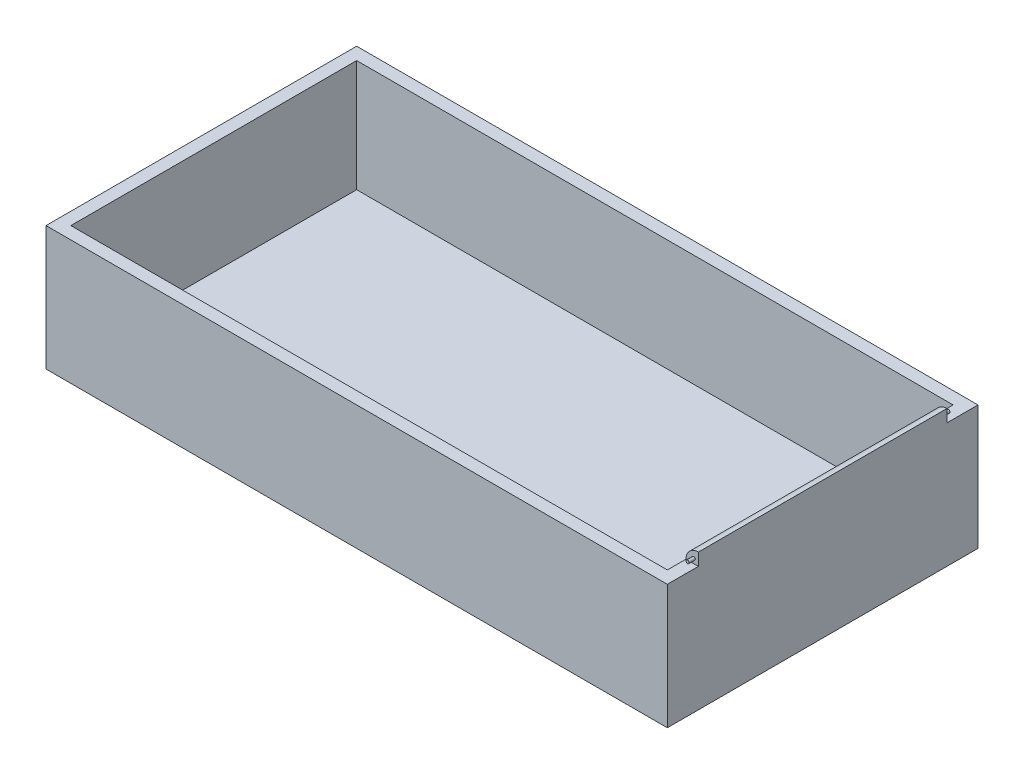
ISO-10303-21;
HEADER;
FILE_DESCRIPTION(('STEP AP214'),'2;1');
FILE_NAME('part.step','',(''),(''),'','','');
FILE_SCHEMA(('AUTOMOTIVE_DESIGN { 1 0 10303 214 1 1 1 1 }'));
ENDSEC;
DATA;
#1=APPLICATION_CONTEXT('core data for automotive mechanical design processes');
#2=APPLICATION_PROTOCOL_DEFINITION('international standard','automotive_design',2000,#1);
#3=PRODUCT_CONTEXT('',#1,'mechanical');
#4=PRODUCT('Part','Part','',(#3));
#5=PRODUCT_RELATED_PRODUCT_CATEGORY('part','',(#4));
#6=PRODUCT_DEFINITION_FORMATION('','',#4);
#7=PRODUCT_DEFINITION_CONTEXT('part definition',#1,'design');
#8=PRODUCT_DEFINITION('design','',#6,#7);
#9=PRODUCT_DEFINITION_SHAPE('','',#8);
#10=(LENGTH_UNIT() NAMED_UNIT(*) SI_UNIT(.MILLI.,.METRE.));
#11=(NAMED_UNIT(*) PLANE_ANGLE_UNIT() SI_UNIT($,.RADIAN.));
#12=(NAMED_UNIT(*) SI_UNIT($,.STERADIAN.) SOLID_ANGLE_UNIT());
#13=UNCERTAINTY_MEASURE_WITH_UNIT(LENGTH_MEASURE(1.E-05),#10,'distance_accuracy_value','');
#14=(GEOMETRIC_REPRESENTATION_CONTEXT(3) GLOBAL_UNCERTAINTY_ASSIGNED_CONTEXT((#13)) GLOBAL_UNIT_ASSIGNED_CONTEXT((#10,
#11,#12)) REPRESENTATION_CONTEXT('',''));
#15=CARTESIAN_POINT('',(0.,0.,0.));
#16=DIRECTION('',(0.,0.,1.));
#17=DIRECTION('',(1.,0.,0.));
#18=AXIS2_PLACEMENT_3D('',#15,#16,#17);
#19=CARTESIAN_POINT('',(0.,25.4,0.));
#20=DIRECTION('',(0.,-1.,0.));
#21=DIRECTION('',(0.,0.,-1.));
#22=AXIS2_PLACEMENT_3D('',#19,#20,#21);
#23=PLANE('',#22);
#24=DIRECTION('',(1.,0.,0.));
#25=VECTOR('',#24,1.);
#26=CARTESIAN_POINT('',(124.46,25.4,-6.35));
#27=LINE('',#26,#25);
#28=CARTESIAN_POINT('',(124.46,25.4,-6.35));
#29=VERTEX_POINT('',#28);
#30=CARTESIAN_POINT('',(127.,25.4,-6.35));
#31=VERTEX_POINT('',#30);
#32=EDGE_CURVE('E142',#29,#31,#27,.T.);
#33=ORIENTED_EDGE('',*,*,#32,.F.);
#34=DIRECTION('',(0.,0.,-1.));
#35=VECTOR('',#34,1.);
#36=CARTESIAN_POINT('',(124.46,25.4,0.));
#37=LINE('',#36,#35);
#38=CARTESIAN_POINT('',(124.46,25.4,-2.54));
#39=VERTEX_POINT('',#38);
#40=EDGE_CURVE('E184',#39,#29,#37,.T.);
#41=ORIENTED_EDGE('',*,*,#40,.F.);
#42=DIRECTION('',(1.,0.,0.));
#43=VECTOR('',#42,1.);
#44=CARTESIAN_POINT('',(0.,25.4,-2.54));
#45=LINE('',#44,#43);
#46=CARTESIAN_POINT('',(2.54,25.4,-2.54));
#47=VERTEX_POINT('',#46);
#48=EDGE_CURVE('E182',#47,#39,#45,.T.);
#49=ORIENTED_EDGE('',*,*,#48,.F.);
#50=DIRECTION('',(0.,0.,1.));
#51=VECTOR('',#50,1.);
#52=CARTESIAN_POINT('',(2.54,25.4,0.));
#53=LINE('',#52,#51);
#54=CARTESIAN_POINT('',(2.53999999999997,25.4,-60.96));
#55=VERTEX_POINT('',#54);
#56=EDGE_CURVE('E180',#55,#47,#53,.T.);
#57=ORIENTED_EDGE('',*,*,#56,.F.);
#58=DIRECTION('',(-1.,0.,0.));
#59=VECTOR('',#58,1.);
#60=CARTESIAN_POINT('',(0.,25.4,-60.96));
#61=LINE('',#60,#59);
#62=CARTESIAN_POINT('',(124.46,25.4,-60.96));
#63=VERTEX_POINT('',#62);
#64=EDGE_CURVE('E171',#63,#55,#61,.T.);
#65=ORIENTED_EDGE('',*,*,#64,.F.);
#66=CARTESIAN_POINT('',(124.46,25.4,-57.15));
#67=VERTEX_POINT('',#66);
#68=EDGE_CURVE('E62',#67,#63,#37,.T.);
#69=ORIENTED_EDGE('',*,*,#68,.F.);
#70=DIRECTION('',(1.,0.,0.));
#71=VECTOR('',#70,1.);
#72=CARTESIAN_POINT('',(124.46,25.4,-57.15));
#73=LINE('',#72,#71);
#74=CARTESIAN_POINT('',(127.,25.4,-57.15));
#75=VERTEX_POINT('',#74);
#76=EDGE_CURVE('E135',#67,#75,#73,.T.);
#77=ORIENTED_EDGE('',*,*,#76,.T.);
#78=DIRECTION('',(0.,0.,-1.));
#79=VECTOR('',#78,1.);
#80=CARTESIAN_POINT('',(127.,25.4,0.));
#81=LINE('',#80,#79);
#82=CARTESIAN_POINT('',(127.,25.4,-63.5));
#83=VERTEX_POINT('',#82);
#84=EDGE_CURVE('E194',#75,#83,#81,.T.);
#85=ORIENTED_EDGE('',*,*,#84,.T.);
#86=DIRECTION('',(-1.,0.,0.));
#87=VECTOR('',#86,1.);
#88=CARTESIAN_POINT('',(0.,25.4,-63.5));
#89=LINE('',#88,#87);
#90=CARTESIAN_POINT('',(0.,25.4,-63.5));
#91=VERTEX_POINT('',#90);
#92=EDGE_CURVE('E197',#83,#91,#89,.T.);
#93=ORIENTED_EDGE('',*,*,#92,.T.);
#94=DIRECTION('',(0.,0.,1.));
#95=VECTOR('',#94,1.);
#96=CARTESIAN_POINT('',(0.,25.4,0.));
#97=LINE('',#96,#95);
#98=CARTESIAN_POINT('',(0.,25.4,0.));
#99=VERTEX_POINT('',#98);
#100=EDGE_CURVE('E188',#91,#99,#97,.T.);
#101=ORIENTED_EDGE('',*,*,#100,.T.);
#102=DIRECTION('',(1.,0.,0.));
#103=VECTOR('',#102,1.);
#104=CARTESIAN_POINT('',(0.,25.4,0.));
#105=LINE('',#104,#103);
#106=CARTESIAN_POINT('',(127.,25.4,0.));
#107=VERTEX_POINT('',#106);
#108=EDGE_CURVE('E191',#99,#107,#105,.T.);
#109=ORIENTED_EDGE('',*,*,#108,.T.);
#110=EDGE_CURVE('E195',#107,#31,#81,.T.);
#111=ORIENTED_EDGE('',*,*,#110,.T.);
#112=EDGE_LOOP('',(#33,#41,#49,#57,#65,#69,#77,#85,#93,#101,#109,#111));
#113=FACE_BOUND('',#112,.T.);
#114=ADVANCED_FACE('F39',(#113),#23,.F.);
#115=CARTESIAN_POINT('',(0.,25.4,0.));
#116=DIRECTION('',(1.,0.,0.));
#117=DIRECTION('',(0.,0.,-1.));
#118=AXIS2_PLACEMENT_3D('',#115,#116,#117);
#119=PLANE('',#118);
#120=DIRECTION('',(0.,0.,1.));
#121=VECTOR('',#120,1.);
#122=CARTESIAN_POINT('',(0.,0.,0.));
#123=LINE('',#122,#121);
#124=CARTESIAN_POINT('',(0.,0.,-63.5));
#125=VERTEX_POINT('',#124);
#126=CARTESIAN_POINT('',(0.,0.,0.));
#127=VERTEX_POINT('',#126);
#128=EDGE_CURVE('E165',#125,#127,#123,.T.);
#129=ORIENTED_EDGE('',*,*,#128,.T.);
#130=DIRECTION('',(0.,-1.,0.));
#131=VECTOR('',#130,1.);
#132=CARTESIAN_POINT('',(0.,25.4,0.));
#133=LINE('',#132,#131);
#134=EDGE_CURVE('E47',#99,#127,#133,.T.);
#135=ORIENTED_EDGE('',*,*,#134,.F.);
#136=ORIENTED_EDGE('',*,*,#100,.F.);
#137=DIRECTION('',(0.,-1.,0.));
#138=VECTOR('',#137,1.);
#139=CARTESIAN_POINT('',(0.,25.4,-63.5));
#140=LINE('',#139,#138);
#141=EDGE_CURVE('E199',#91,#125,#140,.T.);
#142=ORIENTED_EDGE('',*,*,#141,.T.);
#143=EDGE_LOOP('',(#129,#135,#136,#142));
#144=FACE_BOUND('',#143,.T.);
#145=ADVANCED_FACE('F41',(#144),#119,.F.);
#146=CARTESIAN_POINT('',(0.,25.4,0.));
#147=DIRECTION('',(0.,0.,-1.));
#148=DIRECTION('',(-1.,0.,0.));
#149=AXIS2_PLACEMENT_3D('',#146,#147,#148);
#150=PLANE('',#149);
#151=DIRECTION('',(1.,0.,0.));
#152=VECTOR('',#151,1.);
#153=CARTESIAN_POINT('',(0.,0.,0.));
#154=LINE('',#153,#152);
#155=CARTESIAN_POINT('',(127.,0.,0.));
#156=VERTEX_POINT('',#155);
#157=EDGE_CURVE('E202',#127,#156,#154,.T.);
#158=ORIENTED_EDGE('',*,*,#157,.T.);
#159=DIRECTION('',(0.,-1.,0.));
#160=VECTOR('',#159,1.);
#161=CARTESIAN_POINT('',(127.,25.4,0.));
#162=LINE('',#161,#160);
#163=EDGE_CURVE('E212',#107,#156,#162,.T.);
#164=ORIENTED_EDGE('',*,*,#163,.F.);
#165=ORIENTED_EDGE('',*,*,#108,.F.);
#166=ORIENTED_EDGE('',*,*,#134,.T.);
#167=EDGE_LOOP('',(#158,#164,#165,#166));
#168=FACE_BOUND('',#167,.T.);
#169=ADVANCED_FACE('F217',(#168),#150,.F.);
#170=CARTESIAN_POINT('',(127.,25.4,0.));
#171=DIRECTION('',(-1.,0.,0.));
#172=DIRECTION('',(0.,0.,1.));
#173=AXIS2_PLACEMENT_3D('',#170,#171,#172);
#174=PLANE('',#173);
#175=DIRECTION('',(0.,0.,-1.));
#176=VECTOR('',#175,1.);
#177=CARTESIAN_POINT('',(127.,0.,0.));
#178=LINE('',#177,#176);
#179=CARTESIAN_POINT('',(127.,0.,-63.5));
#180=VERTEX_POINT('',#179);
#181=EDGE_CURVE('E204',#156,#180,#178,.T.);
#182=ORIENTED_EDGE('',*,*,#181,.T.);
#183=DIRECTION('',(0.,-1.,0.));
#184=VECTOR('',#183,1.);
#185=CARTESIAN_POINT('',(127.,25.4,-63.5));
#186=LINE('',#185,#184);
#187=EDGE_CURVE('E209',#83,#180,#186,.T.);
#188=ORIENTED_EDGE('',*,*,#187,.F.);
#189=ORIENTED_EDGE('',*,*,#84,.F.);
#190=DIRECTION('',(0.,1.,0.));
#191=VECTOR('',#190,1.);
#192=CARTESIAN_POINT('',(127.,25.4,-57.15));
#193=LINE('',#192,#191);
#194=CARTESIAN_POINT('',(127.,27.94,-57.15));
#195=VERTEX_POINT('',#194);
#196=EDGE_CURVE('E54',#75,#195,#193,.T.);
#197=ORIENTED_EDGE('',*,*,#196,.T.);
#198=DIRECTION('',(0.,0.,1.));
#199=VECTOR('',#198,1.);
#200=CARTESIAN_POINT('',(127.,27.94,-57.15));
#201=LINE('',#200,#199);
#202=CARTESIAN_POINT('',(127.,27.94,-6.35));
#203=VERTEX_POINT('',#202);
#204=EDGE_CURVE('E125',#195,#203,#201,.T.);
#205=ORIENTED_EDGE('',*,*,#204,.T.);
#206=DIRECTION('',(0.,1.,0.));
#207=VECTOR('',#206,1.);
#208=CARTESIAN_POINT('',(127.,25.4,-6.35));
#209=LINE('',#208,#207);
#210=EDGE_CURVE('E130',#31,#203,#209,.T.);
#211=ORIENTED_EDGE('',*,*,#210,.F.);
#212=ORIENTED_EDGE('',*,*,#110,.F.);
#213=ORIENTED_EDGE('',*,*,#163,.T.);
#214=EDGE_LOOP('',(#182,#188,#189,#197,#205,#211,#212,#213));
#215=FACE_BOUND('',#214,.T.);
#216=ADVANCED_FACE('F127',(#215),#174,.F.);
#217=CARTESIAN_POINT('',(0.,25.4,-63.5));
#218=DIRECTION('',(0.,0.,1.));
#219=DIRECTION('',(1.,0.,0.));
#220=AXIS2_PLACEMENT_3D('',#217,#218,#219);
#221=PLANE('',#220);
#222=DIRECTION('',(-1.,0.,0.));
#223=VECTOR('',#222,1.);
#224=CARTESIAN_POINT('',(0.,0.,-63.5));
#225=LINE('',#224,#223);
#226=EDGE_CURVE('E192',#180,#125,#225,.T.);
#227=ORIENTED_EDGE('',*,*,#226,.T.);
#228=ORIENTED_EDGE('',*,*,#141,.F.);
#229=ORIENTED_EDGE('',*,*,#92,.F.);
#230=ORIENTED_EDGE('',*,*,#187,.T.);
#231=EDGE_LOOP('',(#227,#228,#229,#230));
#232=FACE_BOUND('',#231,.T.);
#233=ADVANCED_FACE('F230',(#232),#221,.F.);
#234=CARTESIAN_POINT('',(0.,0.,0.));
#235=DIRECTION('',(0.,-1.,0.));
#236=DIRECTION('',(0.,0.,-1.));
#237=AXIS2_PLACEMENT_3D('',#234,#235,#236);
#238=PLANE('',#237);
#239=ORIENTED_EDGE('',*,*,#128,.F.);
#240=ORIENTED_EDGE('',*,*,#226,.F.);
#241=ORIENTED_EDGE('',*,*,#181,.F.);
#242=ORIENTED_EDGE('',*,*,#157,.F.);
#243=EDGE_LOOP('',(#239,#240,#241,#242));
#244=FACE_BOUND('',#243,.T.);
#245=ADVANCED_FACE('F225',(#244),#238,.T.);
#246=CARTESIAN_POINT('',(2.54,25.4,0.));
#247=DIRECTION('',(1.,0.,0.));
#248=DIRECTION('',(0.,0.,-1.));
#249=AXIS2_PLACEMENT_3D('',#246,#247,#248);
#250=PLANE('',#249);
#251=DIRECTION('',(0.,0.,1.));
#252=VECTOR('',#251,1.);
#253=CARTESIAN_POINT('',(2.54,2.54,0.));
#254=LINE('',#253,#252);
#255=CARTESIAN_POINT('',(2.53999999999997,2.54,-60.96));
#256=VERTEX_POINT('',#255);
#257=CARTESIAN_POINT('',(2.54,2.54,-2.54));
#258=VERTEX_POINT('',#257);
#259=EDGE_CURVE('E157',#256,#258,#254,.T.);
#260=ORIENTED_EDGE('',*,*,#259,.F.);
#261=DIRECTION('',(0.,-1.,0.));
#262=VECTOR('',#261,1.);
#263=CARTESIAN_POINT('',(2.53999999999997,25.4,-60.96));
#264=LINE('',#263,#262);
#265=EDGE_CURVE('E167',#55,#256,#264,.T.);
#266=ORIENTED_EDGE('',*,*,#265,.F.);
#267=ORIENTED_EDGE('',*,*,#56,.T.);
#268=DIRECTION('',(0.,-1.,0.));
#269=VECTOR('',#268,1.);
#270=CARTESIAN_POINT('',(2.54,25.4,-2.54));
#271=LINE('',#270,#269);
#272=EDGE_CURVE('E162',#47,#258,#271,.T.);
#273=ORIENTED_EDGE('',*,*,#272,.T.);
#274=EDGE_LOOP('',(#260,#266,#267,#273));
#275=FACE_BOUND('',#274,.T.);
#276=ADVANCED_FACE('F258',(#275),#250,.T.);
#277=CARTESIAN_POINT('',(0.,25.4,-2.54));
#278=DIRECTION('',(0.,0.,-1.));
#279=DIRECTION('',(-1.,0.,0.));
#280=AXIS2_PLACEMENT_3D('',#277,#278,#279);
#281=PLANE('',#280);
#282=DIRECTION('',(1.,0.,0.));
#283=VECTOR('',#282,1.);
#284=CARTESIAN_POINT('',(0.,2.54,-2.54));
#285=LINE('',#284,#283);
#286=CARTESIAN_POINT('',(124.46,2.54,-2.54));
#287=VERTEX_POINT('',#286);
#288=EDGE_CURVE('E161',#258,#287,#285,.T.);
#289=ORIENTED_EDGE('',*,*,#288,.F.);
#290=ORIENTED_EDGE('',*,*,#272,.F.);
#291=ORIENTED_EDGE('',*,*,#48,.T.);
#292=DIRECTION('',(0.,-1.,0.));
#293=VECTOR('',#292,1.);
#294=CARTESIAN_POINT('',(124.46,25.4,-2.54));
#295=LINE('',#294,#293);
#296=EDGE_CURVE('E166',#39,#287,#295,.T.);
#297=ORIENTED_EDGE('',*,*,#296,.T.);
#298=EDGE_LOOP('',(#289,#290,#291,#297));
#299=FACE_BOUND('',#298,.T.);
#300=ADVANCED_FACE('F281',(#299),#281,.T.);
#301=CARTESIAN_POINT('',(124.46,25.4,0.));
#302=DIRECTION('',(-1.,0.,0.));
#303=DIRECTION('',(0.,0.,1.));
#304=AXIS2_PLACEMENT_3D('',#301,#302,#303);
#305=PLANE('',#304);
#306=DIRECTION('',(0.,0.,-1.));
#307=VECTOR('',#306,1.);
#308=CARTESIAN_POINT('',(124.46,2.54,0.));
#309=LINE('',#308,#307);
#310=CARTESIAN_POINT('',(124.46,2.54,-60.96));
#311=VERTEX_POINT('',#310);
#312=EDGE_CURVE('E173',#287,#311,#309,.T.);
#313=ORIENTED_EDGE('',*,*,#312,.F.);
#314=ORIENTED_EDGE('',*,*,#296,.F.);
#315=ORIENTED_EDGE('',*,*,#40,.T.);
#316=DIRECTION('',(0.,0.,1.));
#317=VECTOR('',#316,1.);
#318=CARTESIAN_POINT('',(124.46,25.4,-57.15));
#319=LINE('',#318,#317);
#320=EDGE_CURVE('E134',#67,#29,#319,.T.);
#321=ORIENTED_EDGE('',*,*,#320,.F.);
#322=ORIENTED_EDGE('',*,*,#68,.T.);
#323=DIRECTION('',(0.,-1.,0.));
#324=VECTOR('',#323,1.);
#325=CARTESIAN_POINT('',(124.46,25.4,-60.96));
#326=LINE('',#325,#324);
#327=EDGE_CURVE('E170',#63,#311,#326,.T.);
#328=ORIENTED_EDGE('',*,*,#327,.T.);
#329=EDGE_LOOP('',(#313,#314,#315,#321,#322,#328));
#330=FACE_BOUND('',#329,.T.);
#331=ADVANCED_FACE('F289',(#330),#305,.T.);
#332=CARTESIAN_POINT('',(0.,25.4,-60.96));
#333=DIRECTION('',(0.,0.,1.));
#334=DIRECTION('',(1.,0.,0.));
#335=AXIS2_PLACEMENT_3D('',#332,#333,#334);
#336=PLANE('',#335);
#337=DIRECTION('',(-1.,0.,0.));
#338=VECTOR('',#337,1.);
#339=CARTESIAN_POINT('',(0.,2.54,-60.96));
#340=LINE('',#339,#338);
#341=EDGE_CURVE('E177',#311,#256,#340,.T.);
#342=ORIENTED_EDGE('',*,*,#341,.F.);
#343=ORIENTED_EDGE('',*,*,#327,.F.);
#344=ORIENTED_EDGE('',*,*,#64,.T.);
#345=ORIENTED_EDGE('',*,*,#265,.T.);
#346=EDGE_LOOP('',(#342,#343,#344,#345));
#347=FACE_BOUND('',#346,.T.);
#348=ADVANCED_FACE('F299',(#347),#336,.T.);
#349=CARTESIAN_POINT('',(0.,2.54,0.));
#350=DIRECTION('',(0.,-1.,0.));
#351=DIRECTION('',(0.,0.,-1.));
#352=AXIS2_PLACEMENT_3D('',#349,#350,#351);
#353=PLANE('',#352);
#354=ORIENTED_EDGE('',*,*,#259,.T.);
#355=ORIENTED_EDGE('',*,*,#288,.T.);
#356=ORIENTED_EDGE('',*,*,#312,.T.);
#357=ORIENTED_EDGE('',*,*,#341,.T.);
#358=EDGE_LOOP('',(#354,#355,#356,#357));
#359=FACE_BOUND('',#358,.T.);
#360=ADVANCED_FACE('F244',(#359),#353,.F.);
#361=CARTESIAN_POINT('',(127.,25.4,-57.15));
#362=DIRECTION('',(0.,0.,1.));
#363=DIRECTION('',(1.,0.,0.));
#364=AXIS2_PLACEMENT_3D('',#361,#362,#363);
#365=CYLINDRICAL_SURFACE('',#364,2.54);
#366=ORIENTED_EDGE('',*,*,#320,.T.);
#367=CARTESIAN_POINT('',(127.,25.4,-6.35));
#368=DIRECTION('',(0.,0.,1.));
#369=DIRECTION('',(1.,0.,0.));
#370=AXIS2_PLACEMENT_3D('',#367,#368,#369);
#371=CIRCLE('',#370,2.54);
#372=EDGE_CURVE('E138',#203,#29,#371,.T.);
#373=ORIENTED_EDGE('',*,*,#372,.F.);
#374=ORIENTED_EDGE('',*,*,#204,.F.);
#375=CARTESIAN_POINT('',(127.,25.4,-57.15));
#376=DIRECTION('',(0.,0.,1.));
#377=DIRECTION('',(1.,0.,0.));
#378=AXIS2_PLACEMENT_3D('',#375,#376,#377);
#379=CIRCLE('',#378,2.54);
#380=EDGE_CURVE('E154',#195,#67,#379,.T.);
#381=ORIENTED_EDGE('',*,*,#380,.T.);
#382=EDGE_LOOP('',(#366,#373,#374,#381));
#383=FACE_BOUND('',#382,.T.);
#384=ADVANCED_FACE('F139',(#383),#365,.T.);
#385=CARTESIAN_POINT('',(127.,25.4,-57.15));
#386=DIRECTION('',(0.,0.,1.));
#387=DIRECTION('',(1.,0.,0.));
#388=AXIS2_PLACEMENT_3D('',#385,#386,#387);
#389=PLANE('',#388);
#390=CARTESIAN_POINT('',(126.0475,26.3525,-57.15));
#391=DIRECTION('',(0.,0.,1.));
#392=DIRECTION('',(1.,0.,0.));
#393=AXIS2_PLACEMENT_3D('',#390,#391,#392);
#394=CIRCLE('',#393,0.317500000000008);
#395=CARTESIAN_POINT('',(126.365,26.3525,-57.15));
#396=VERTEX_POINT('',#395);
#397=EDGE_CURVE('E145',#396,#396,#394,.T.);
#398=ORIENTED_EDGE('',*,*,#397,.T.);
#399=EDGE_LOOP('',(#398));
#400=FACE_BOUND('',#399,.T.);
#401=ORIENTED_EDGE('',*,*,#196,.F.);
#402=ORIENTED_EDGE('',*,*,#76,.F.);
#403=ORIENTED_EDGE('',*,*,#380,.F.);
#404=EDGE_LOOP('',(#401,#402,#403));
#405=FACE_BOUND('',#404,.T.);
#406=ADVANCED_FACE('F233',(#400,#405),#389,.F.);
#407=CARTESIAN_POINT('',(127.,25.4,-6.35));
#408=DIRECTION('',(0.,0.,1.));
#409=DIRECTION('',(1.,0.,0.));
#410=AXIS2_PLACEMENT_3D('',#407,#408,#409);
#411=PLANE('',#410);
#412=CARTESIAN_POINT('',(126.0475,26.3525,-6.35));
#413=DIRECTION('',(0.,0.,1.));
#414=DIRECTION('',(1.,0.,0.));
#415=AXIS2_PLACEMENT_3D('',#412,#413,#414);
#416=CIRCLE('',#415,0.317500000000008);
#417=CARTESIAN_POINT('',(126.365,26.3525,-6.35));
#418=VERTEX_POINT('',#417);
#419=EDGE_CURVE('E11',#418,#418,#416,.T.);
#420=ORIENTED_EDGE('',*,*,#419,.F.);
#421=EDGE_LOOP('',(#420));
#422=FACE_BOUND('',#421,.T.);
#423=ORIENTED_EDGE('',*,*,#210,.T.);
#424=ORIENTED_EDGE('',*,*,#372,.T.);
#425=ORIENTED_EDGE('',*,*,#32,.T.);
#426=EDGE_LOOP('',(#423,#424,#425));
#427=FACE_BOUND('',#426,.T.);
#428=ADVANCED_FACE('F144',(#422,#427),#411,.T.);
#429=CARTESIAN_POINT('',(126.0475,26.3525,-5.08));
#430=DIRECTION('',(0.,0.,1.));
#431=DIRECTION('',(1.,0.,0.));
#432=AXIS2_PLACEMENT_3D('',#429,#430,#431);
#433=PLANE('',#432);
#434=CARTESIAN_POINT('',(126.0475,26.3525,-5.08));
#435=DIRECTION('',(0.,0.,1.));
#436=DIRECTION('',(1.,0.,0.));
#437=AXIS2_PLACEMENT_3D('',#434,#435,#436);
#438=CIRCLE('',#437,0.317500000000008);
#439=CARTESIAN_POINT('',(126.365,26.3525,-5.08));
#440=VERTEX_POINT('',#439);
#441=EDGE_CURVE('E376',#440,#440,#438,.T.);
#442=ORIENTED_EDGE('',*,*,#441,.T.);
#443=EDGE_LOOP('',(#442));
#444=FACE_BOUND('',#443,.T.);
#445=ADVANCED_FACE('F241',(#444),#433,.T.);
#446=CARTESIAN_POINT('',(126.0475,26.3525,-58.42));
#447=DIRECTION('',(0.,0.,1.));
#448=DIRECTION('',(1.,0.,0.));
#449=AXIS2_PLACEMENT_3D('',#446,#447,#448);
#450=CYLINDRICAL_SURFACE('',#449,0.317500000000008);
#451=ORIENTED_EDGE('',*,*,#419,.T.);
#452=EDGE_LOOP('',(#451));
#453=FACE_BOUND('',#452,.T.);
#454=ORIENTED_EDGE('',*,*,#441,.F.);
#455=EDGE_LOOP('',(#454));
#456=FACE_BOUND('',#455,.T.);
#457=ADVANCED_FACE('F341',(#453,#456),#450,.T.);
#458=CARTESIAN_POINT('',(126.0475,26.3525,-58.42));
#459=DIRECTION('',(0.,0.,1.));
#460=DIRECTION('',(1.,0.,0.));
#461=AXIS2_PLACEMENT_3D('',#458,#459,#460);
#462=CIRCLE('',#461,0.317500000000008);
#463=CARTESIAN_POINT('',(126.365,26.3525,-58.42));
#464=VERTEX_POINT('',#463);
#465=EDGE_CURVE('E148',#464,#464,#462,.T.);
#466=ORIENTED_EDGE('',*,*,#465,.T.);
#467=EDGE_LOOP('',(#466));
#468=FACE_BOUND('',#467,.T.);
#469=ORIENTED_EDGE('',*,*,#397,.F.);
#470=EDGE_LOOP('',(#469));
#471=FACE_BOUND('',#470,.T.);
#472=ADVANCED_FACE('F351',(#468,#471),#450,.T.);
#473=CARTESIAN_POINT('',(126.0475,26.3525,-58.42));
#474=DIRECTION('',(0.,0.,1.));
#475=DIRECTION('',(1.,0.,0.));
#476=AXIS2_PLACEMENT_3D('',#473,#474,#475);
#477=PLANE('',#476);
#478=ORIENTED_EDGE('',*,*,#465,.F.);
#479=EDGE_LOOP('',(#478));
#480=FACE_BOUND('',#479,.T.);
#481=ADVANCED_FACE('F361',(#480),#477,.F.);
#482=CLOSED_SHELL('',(#114,#145,#169,#216,#233,#245,#276,#300,#331,#348,#360,#384,#406,#428,
#445,#457,#472,#481));
#483=MANIFOLD_SOLID_BREP('B2',#482);
#484=ADVANCED_BREP_SHAPE_REPRESENTATION('',(#18,#483),#14);
#485=SHAPE_DEFINITION_REPRESENTATION(#9,#484);
ENDSEC;
END-ISO-10303-21;
